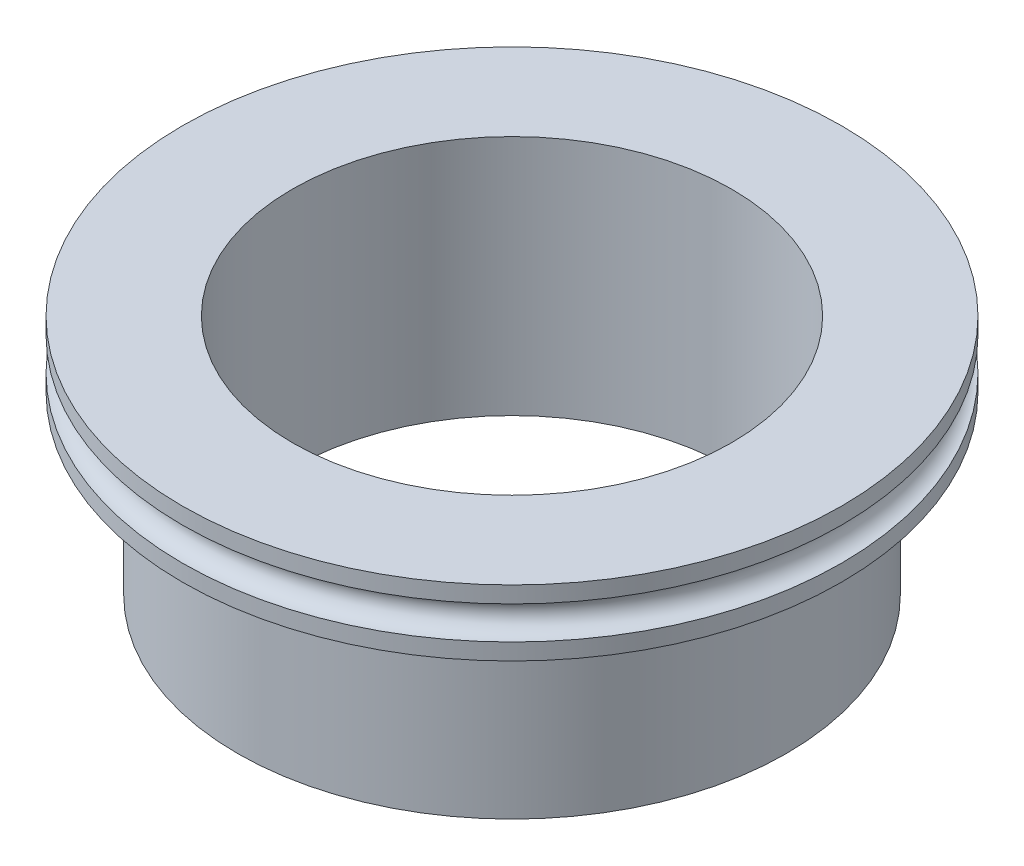
ISO-10303-21;
HEADER;
FILE_DESCRIPTION(('STEP AP214'),'2;1');
FILE_NAME('part.step','',(''),(''),'','','');
FILE_SCHEMA(('AUTOMOTIVE_DESIGN { 1 0 10303 214 1 1 1 1 }'));
ENDSEC;
DATA;
#1=APPLICATION_CONTEXT('core data for automotive mechanical design processes');
#2=APPLICATION_PROTOCOL_DEFINITION('international standard','automotive_design',2000,#1);
#3=PRODUCT_CONTEXT('',#1,'mechanical');
#4=PRODUCT('Part','Part','',(#3));
#5=PRODUCT_RELATED_PRODUCT_CATEGORY('part','',(#4));
#6=PRODUCT_DEFINITION_FORMATION('','',#4);
#7=PRODUCT_DEFINITION_CONTEXT('part definition',#1,'design');
#8=PRODUCT_DEFINITION('design','',#6,#7);
#9=PRODUCT_DEFINITION_SHAPE('','',#8);
#10=(LENGTH_UNIT() NAMED_UNIT(*) SI_UNIT(.MILLI.,.METRE.));
#11=(NAMED_UNIT(*) PLANE_ANGLE_UNIT() SI_UNIT($,.RADIAN.));
#12=(NAMED_UNIT(*) SI_UNIT($,.STERADIAN.) SOLID_ANGLE_UNIT());
#13=UNCERTAINTY_MEASURE_WITH_UNIT(LENGTH_MEASURE(1.E-05),#10,'distance_accuracy_value','');
#14=(GEOMETRIC_REPRESENTATION_CONTEXT(3) GLOBAL_UNCERTAINTY_ASSIGNED_CONTEXT((#13)) GLOBAL_UNIT_ASSIGNED_CONTEXT((#10,
#11,#12)) REPRESENTATION_CONTEXT('',''));
#15=CARTESIAN_POINT('',(0.,0.,0.));
#16=DIRECTION('',(0.,0.,1.));
#17=DIRECTION('',(1.,0.,0.));
#18=AXIS2_PLACEMENT_3D('',#15,#16,#17);
#19=CARTESIAN_POINT('',(0.,-1.5,0.));
#20=DIRECTION('',(0.,1.,0.));
#21=DIRECTION('',(0.,0.,1.));
#22=AXIS2_PLACEMENT_3D('',#19,#20,#21);
#23=PLANE('',#22);
#24=CARTESIAN_POINT('',(0.,-1.5,0.));
#25=DIRECTION('',(0.,1.,0.));
#26=DIRECTION('',(0.,0.,1.));
#27=AXIS2_PLACEMENT_3D('',#24,#25,#26);
#28=CIRCLE('',#27,15.);
#29=CARTESIAN_POINT('',(0.,-1.5,15.));
#30=VERTEX_POINT('',#29);
#31=EDGE_CURVE('E42',#30,#30,#28,.T.);
#32=ORIENTED_EDGE('',*,*,#31,.F.);
#33=EDGE_LOOP('',(#32));
#34=FACE_BOUND('',#33,.T.);
#35=CARTESIAN_POINT('',(0.,-1.5,0.));
#36=DIRECTION('',(0.,1.,0.));
#37=DIRECTION('',(0.,0.,1.));
#38=AXIS2_PLACEMENT_3D('',#35,#36,#37);
#39=CIRCLE('',#38,12.5);
#40=CARTESIAN_POINT('',(0.,-1.5,12.5));
#41=VERTEX_POINT('',#40);
#42=EDGE_CURVE('E10',#41,#41,#39,.F.);
#43=ORIENTED_EDGE('',*,*,#42,.F.);
#44=EDGE_LOOP('',(#43));
#45=FACE_BOUND('',#44,.T.);
#46=ADVANCED_FACE('F31',(#34,#45),#23,.F.);
#47=CARTESIAN_POINT('',(0.,1.5,0.));
#48=DIRECTION('',(0.,-1.,0.));
#49=DIRECTION('',(0.,0.,-1.));
#50=AXIS2_PLACEMENT_3D('',#47,#48,#49);
#51=CYLINDRICAL_SURFACE('',#50,15.);
#52=CARTESIAN_POINT('',(0.,1.5,0.));
#53=DIRECTION('',(0.,1.,0.));
#54=DIRECTION('',(0.,0.,1.));
#55=AXIS2_PLACEMENT_3D('',#52,#53,#54);
#56=CIRCLE('',#55,15.);
#57=CARTESIAN_POINT('',(0.,1.5,15.));
#58=VERTEX_POINT('',#57);
#59=EDGE_CURVE('E38',#58,#58,#56,.T.);
#60=ORIENTED_EDGE('',*,*,#59,.F.);
#61=EDGE_LOOP('',(#60));
#62=FACE_BOUND('',#61,.T.);
#63=CARTESIAN_POINT('',(0.,0.750000000000003,0.));
#64=DIRECTION('',(0.,-1.,0.));
#65=DIRECTION('',(0.,0.,-1.));
#66=AXIS2_PLACEMENT_3D('',#63,#64,#65);
#67=CIRCLE('',#66,15.);
#68=CARTESIAN_POINT('',(0.,0.750000000000003,-15.));
#69=VERTEX_POINT('',#68);
#70=EDGE_CURVE('E47',#69,#69,#67,.T.);
#71=ORIENTED_EDGE('',*,*,#70,.F.);
#72=EDGE_LOOP('',(#71));
#73=FACE_BOUND('',#72,.T.);
#74=ADVANCED_FACE('F33',(#62,#73),#51,.T.);
#75=CARTESIAN_POINT('',(0.,1.5,0.));
#76=DIRECTION('',(0.,1.,0.));
#77=DIRECTION('',(0.,0.,1.));
#78=AXIS2_PLACEMENT_3D('',#75,#76,#77);
#79=PLANE('',#78);
#80=CARTESIAN_POINT('',(0.,1.5,0.));
#81=DIRECTION('',(0.,1.,0.));
#82=DIRECTION('',(0.,0.,1.));
#83=AXIS2_PLACEMENT_3D('',#80,#81,#82);
#84=CIRCLE('',#83,10.);
#85=CARTESIAN_POINT('',(0.,1.5,10.));
#86=VERTEX_POINT('',#85);
#87=EDGE_CURVE('E104',#86,#86,#84,.T.);
#88=ORIENTED_EDGE('',*,*,#87,.F.);
#89=EDGE_LOOP('',(#88));
#90=FACE_BOUND('',#89,.T.);
#91=ORIENTED_EDGE('',*,*,#59,.T.);
#92=EDGE_LOOP('',(#91));
#93=FACE_BOUND('',#92,.T.);
#94=ADVANCED_FACE('F61',(#90,#93),#79,.T.);
#95=CARTESIAN_POINT('',(0.,0.,0.));
#96=DIRECTION('',(0.,1.,0.));
#97=DIRECTION('',(0.,0.,1.));
#98=AXIS2_PLACEMENT_3D('',#95,#96,#97);
#99=TOROIDAL_SURFACE('',#98,15.,0.750000000000002);
#100=CARTESIAN_POINT('',(0.,-0.750000000000001,0.));
#101=DIRECTION('',(0.,1.,0.));
#102=DIRECTION('',(0.,0.,1.));
#103=AXIS2_PLACEMENT_3D('',#100,#101,#102);
#104=CIRCLE('',#103,15.);
#105=CARTESIAN_POINT('',(0.,-0.750000000000001,15.));
#106=VERTEX_POINT('',#105);
#107=EDGE_CURVE('E53',#106,#106,#104,.T.);
#108=ORIENTED_EDGE('',*,*,#107,.T.);
#109=EDGE_LOOP('',(#108));
#110=FACE_BOUND('',#109,.T.);
#111=ORIENTED_EDGE('',*,*,#70,.T.);
#112=EDGE_LOOP('',(#111));
#113=FACE_BOUND('',#112,.T.);
#114=ADVANCED_FACE('F58',(#110,#113),#99,.F.);
#115=ORIENTED_EDGE('',*,*,#31,.T.);
#116=EDGE_LOOP('',(#115));
#117=FACE_BOUND('',#116,.T.);
#118=ORIENTED_EDGE('',*,*,#107,.F.);
#119=EDGE_LOOP('',(#118));
#120=FACE_BOUND('',#119,.T.);
#121=ADVANCED_FACE('F63',(#117,#120),#51,.T.);
#122=CARTESIAN_POINT('',(0.,-9.5,0.));
#123=DIRECTION('',(0.,1.,0.));
#124=DIRECTION('',(0.,0.,1.));
#125=AXIS2_PLACEMENT_3D('',#122,#123,#124);
#126=CYLINDRICAL_SURFACE('',#125,12.5);
#127=CARTESIAN_POINT('',(0.,-9.5,0.));
#128=DIRECTION('',(0.,-1.,0.));
#129=DIRECTION('',(0.,0.,-1.));
#130=AXIS2_PLACEMENT_3D('',#127,#128,#129);
#131=CIRCLE('',#130,12.5);
#132=CARTESIAN_POINT('',(0.,-9.5,-12.5));
#133=VERTEX_POINT('',#132);
#134=EDGE_CURVE('E50',#133,#133,#131,.T.);
#135=ORIENTED_EDGE('',*,*,#134,.F.);
#136=EDGE_LOOP('',(#135));
#137=FACE_BOUND('',#136,.T.);
#138=ORIENTED_EDGE('',*,*,#42,.T.);
#139=EDGE_LOOP('',(#138));
#140=FACE_BOUND('',#139,.T.);
#141=ADVANCED_FACE('F72',(#137,#140),#126,.T.);
#142=CARTESIAN_POINT('',(0.,-9.5,0.));
#143=DIRECTION('',(0.,-1.,0.));
#144=DIRECTION('',(0.,0.,-1.));
#145=AXIS2_PLACEMENT_3D('',#142,#143,#144);
#146=PLANE('',#145);
#147=CARTESIAN_POINT('',(0.,-9.5,0.));
#148=DIRECTION('',(0.,1.,0.));
#149=DIRECTION('',(0.,0.,1.));
#150=AXIS2_PLACEMENT_3D('',#147,#148,#149);
#151=CIRCLE('',#150,10.);
#152=CARTESIAN_POINT('',(0.,-9.5,10.));
#153=VERTEX_POINT('',#152);
#154=EDGE_CURVE('E101',#153,#153,#151,.T.);
#155=ORIENTED_EDGE('',*,*,#154,.T.);
#156=EDGE_LOOP('',(#155));
#157=FACE_BOUND('',#156,.T.);
#158=ORIENTED_EDGE('',*,*,#134,.T.);
#159=EDGE_LOOP('',(#158));
#160=FACE_BOUND('',#159,.T.);
#161=ADVANCED_FACE('F78',(#157,#160),#146,.T.);
#162=CARTESIAN_POINT('',(0.,-9.5,0.));
#163=DIRECTION('',(0.,1.,0.));
#164=DIRECTION('',(0.,0.,1.));
#165=AXIS2_PLACEMENT_3D('',#162,#163,#164);
#166=CYLINDRICAL_SURFACE('',#165,10.);
#167=ORIENTED_EDGE('',*,*,#154,.F.);
#168=EDGE_LOOP('',(#167));
#169=FACE_BOUND('',#168,.T.);
#170=ORIENTED_EDGE('',*,*,#87,.T.);
#171=EDGE_LOOP('',(#170));
#172=FACE_BOUND('',#171,.T.);
#173=ADVANCED_FACE('F92',(#169,#172),#166,.F.);
#174=CLOSED_SHELL('',(#46,#74,#94,#114,#121,#141,#161,#173));
#175=MANIFOLD_SOLID_BREP('B2',#174);
#176=ADVANCED_BREP_SHAPE_REPRESENTATION('',(#18,#175),#14);
#177=SHAPE_DEFINITION_REPRESENTATION(#9,#176);
ENDSEC;
END-ISO-10303-21;
